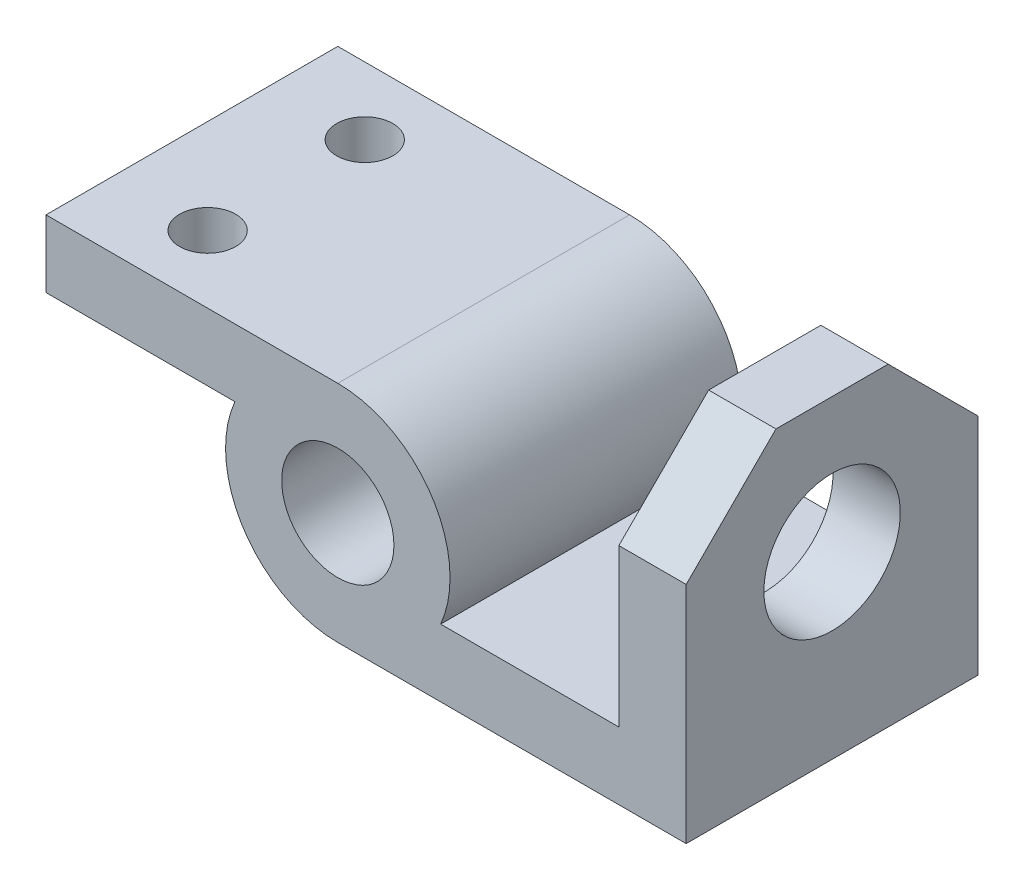
ISO-10303-21;
HEADER;
FILE_DESCRIPTION(('STEP AP214'),'2;1');
FILE_NAME('part.step','',(''),(''),'','','');
FILE_SCHEMA(('AUTOMOTIVE_DESIGN { 1 0 10303 214 1 1 1 1 }'));
ENDSEC;
DATA;
#1=APPLICATION_CONTEXT('core data for automotive mechanical design processes');
#2=APPLICATION_PROTOCOL_DEFINITION('international standard','automotive_design',2000,#1);
#3=PRODUCT_CONTEXT('',#1,'mechanical');
#4=PRODUCT('Part','Part','',(#3));
#5=PRODUCT_RELATED_PRODUCT_CATEGORY('part','',(#4));
#6=PRODUCT_DEFINITION_FORMATION('','',#4);
#7=PRODUCT_DEFINITION_CONTEXT('part definition',#1,'design');
#8=PRODUCT_DEFINITION('design','',#6,#7);
#9=PRODUCT_DEFINITION_SHAPE('','',#8);
#10=(LENGTH_UNIT() NAMED_UNIT(*) SI_UNIT(.MILLI.,.METRE.));
#11=(NAMED_UNIT(*) PLANE_ANGLE_UNIT() SI_UNIT($,.RADIAN.));
#12=(NAMED_UNIT(*) SI_UNIT($,.STERADIAN.) SOLID_ANGLE_UNIT());
#13=UNCERTAINTY_MEASURE_WITH_UNIT(LENGTH_MEASURE(1.E-05),#10,'distance_accuracy_value','');
#14=(GEOMETRIC_REPRESENTATION_CONTEXT(3) GLOBAL_UNCERTAINTY_ASSIGNED_CONTEXT((#13)) GLOBAL_UNIT_ASSIGNED_CONTEXT((#10,
#11,#12)) REPRESENTATION_CONTEXT('',''));
#15=CARTESIAN_POINT('',(0.,0.,0.));
#16=DIRECTION('',(0.,0.,1.));
#17=DIRECTION('',(1.,0.,0.));
#18=AXIS2_PLACEMENT_3D('',#15,#16,#17);
#19=CARTESIAN_POINT('',(0.,12.7,82.55));
#20=DIRECTION('',(0.,1.,0.));
#21=DIRECTION('',(-1.,0.,0.));
#22=AXIS2_PLACEMENT_3D('',#19,#20,#21);
#23=PLANE('',#22);
#24=CARTESIAN_POINT('',(-55.88,12.7,19.05));
#25=DIRECTION('',(0.,1.,0.));
#26=DIRECTION('',(-1.,0.,0.));
#27=AXIS2_PLACEMENT_3D('',#24,#25,#26);
#28=CIRCLE('',#27,7.9375);
#29=CARTESIAN_POINT('',(-63.8175,12.7,19.05));
#30=VERTEX_POINT('',#29);
#31=EDGE_CURVE('E282',#30,#30,#28,.T.);
#32=ORIENTED_EDGE('',*,*,#31,.T.);
#33=EDGE_LOOP('',(#32));
#34=FACE_BOUND('',#33,.T.);
#35=CARTESIAN_POINT('',(-55.88,12.7,63.5));
#36=DIRECTION('',(0.,1.,0.));
#37=DIRECTION('',(-1.,0.,0.));
#38=AXIS2_PLACEMENT_3D('',#35,#36,#37);
#39=CIRCLE('',#38,7.9375);
#40=CARTESIAN_POINT('',(-63.8175,12.7,63.5));
#41=VERTEX_POINT('',#40);
#42=EDGE_CURVE('E286',#41,#41,#39,.T.);
#43=ORIENTED_EDGE('',*,*,#42,.T.);
#44=EDGE_LOOP('',(#43));
#45=FACE_BOUND('',#44,.T.);
#46=DIRECTION('',(1.,0.,0.));
#47=VECTOR('',#46,1.);
#48=CARTESIAN_POINT('',(0.,12.7,0.));
#49=LINE('',#48,#47);
#50=CARTESIAN_POINT('',(-82.55,12.7,0.));
#51=VERTEX_POINT('',#50);
#52=CARTESIAN_POINT('',(-29.0993556629696,12.7,0.));
#53=VERTEX_POINT('',#52);
#54=EDGE_CURVE('E145',#51,#53,#49,.T.);
#55=ORIENTED_EDGE('',*,*,#54,.T.);
#56=DIRECTION('',(0.,0.,-1.));
#57=VECTOR('',#56,1.);
#58=CARTESIAN_POINT('',(-29.0993556629696,12.7,82.55));
#59=LINE('',#58,#57);
#60=CARTESIAN_POINT('',(-29.0993556629696,12.7,82.55));
#61=VERTEX_POINT('',#60);
#62=EDGE_CURVE('E11',#61,#53,#59,.T.);
#63=ORIENTED_EDGE('',*,*,#62,.F.);
#64=DIRECTION('',(1.,0.,0.));
#65=VECTOR('',#64,1.);
#66=CARTESIAN_POINT('',(0.,12.7,82.55));
#67=LINE('',#66,#65);
#68=CARTESIAN_POINT('',(-82.55,12.7,82.55));
#69=VERTEX_POINT('',#68);
#70=EDGE_CURVE('E168',#69,#61,#67,.T.);
#71=ORIENTED_EDGE('',*,*,#70,.F.);
#72=DIRECTION('',(0.,0.,-1.));
#73=VECTOR('',#72,1.);
#74=CARTESIAN_POINT('',(-82.55,12.7,82.55));
#75=LINE('',#74,#73);
#76=EDGE_CURVE('E144',#69,#51,#75,.T.);
#77=ORIENTED_EDGE('',*,*,#76,.T.);
#78=EDGE_LOOP('',(#55,#63,#71,#77));
#79=FACE_BOUND('',#78,.T.);
#80=ADVANCED_FACE('F42',(#34,#45,#79),#23,.F.);
#81=CARTESIAN_POINT('',(0.,0.,82.55));
#82=DIRECTION('',(0.,0.,-1.));
#83=DIRECTION('',(-1.,0.,0.));
#84=AXIS2_PLACEMENT_3D('',#81,#82,#83);
#85=CYLINDRICAL_SURFACE('',#84,31.75);
#86=CARTESIAN_POINT('',(0.,0.,0.));
#87=DIRECTION('',(0.,0.,1.));
#88=DIRECTION('',(1.,0.,0.));
#89=AXIS2_PLACEMENT_3D('',#86,#87,#88);
#90=CIRCLE('',#89,31.75);
#91=CARTESIAN_POINT('',(0.,-31.75,0.));
#92=VERTEX_POINT('',#91);
#93=EDGE_CURVE('E149',#53,#92,#90,.T.);
#94=ORIENTED_EDGE('',*,*,#93,.T.);
#95=DIRECTION('',(0.,0.,-1.));
#96=VECTOR('',#95,1.);
#97=CARTESIAN_POINT('',(0.,-31.75,82.55));
#98=LINE('',#97,#96);
#99=CARTESIAN_POINT('',(0.,-31.75,82.55));
#100=VERTEX_POINT('',#99);
#101=EDGE_CURVE('E51',#100,#92,#98,.T.);
#102=ORIENTED_EDGE('',*,*,#101,.F.);
#103=CARTESIAN_POINT('',(0.,0.,82.55));
#104=DIRECTION('',(0.,0.,1.));
#105=DIRECTION('',(1.,0.,0.));
#106=AXIS2_PLACEMENT_3D('',#103,#104,#105);
#107=CIRCLE('',#106,31.75);
#108=EDGE_CURVE('E100',#61,#100,#107,.T.);
#109=ORIENTED_EDGE('',*,*,#108,.F.);
#110=ORIENTED_EDGE('',*,*,#62,.T.);
#111=EDGE_LOOP('',(#94,#102,#109,#110));
#112=FACE_BOUND('',#111,.T.);
#113=ADVANCED_FACE('F330',(#112),#85,.T.);
#114=CARTESIAN_POINT('',(0.,-31.75,82.55));
#115=DIRECTION('',(0.,1.,0.));
#116=DIRECTION('',(0.,0.,1.));
#117=AXIS2_PLACEMENT_3D('',#114,#115,#116);
#118=PLANE('',#117);
#119=DIRECTION('',(1.,0.,0.));
#120=VECTOR('',#119,1.);
#121=CARTESIAN_POINT('',(0.,-31.75,0.));
#122=LINE('',#121,#120);
#123=CARTESIAN_POINT('',(98.552,-31.75,0.));
#124=VERTEX_POINT('',#123);
#125=EDGE_CURVE('E153',#92,#124,#122,.T.);
#126=ORIENTED_EDGE('',*,*,#125,.T.);
#127=DIRECTION('',(0.,0.,-1.));
#128=VECTOR('',#127,1.);
#129=CARTESIAN_POINT('',(98.552,-31.75,82.55));
#130=LINE('',#129,#128);
#131=CARTESIAN_POINT('',(98.552,-31.75,82.55));
#132=VERTEX_POINT('',#131);
#133=EDGE_CURVE('E208',#132,#124,#130,.T.);
#134=ORIENTED_EDGE('',*,*,#133,.F.);
#135=DIRECTION('',(1.,0.,0.));
#136=VECTOR('',#135,1.);
#137=CARTESIAN_POINT('',(0.,-31.75,82.55));
#138=LINE('',#137,#136);
#139=EDGE_CURVE('E189',#100,#132,#138,.T.);
#140=ORIENTED_EDGE('',*,*,#139,.F.);
#141=ORIENTED_EDGE('',*,*,#101,.T.);
#142=EDGE_LOOP('',(#126,#134,#140,#141));
#143=FACE_BOUND('',#142,.T.);
#144=ADVANCED_FACE('F184',(#143),#118,.F.);
#145=CARTESIAN_POINT('',(0.,-12.7,82.55));
#146=DIRECTION('',(0.,-1.,0.));
#147=DIRECTION('',(1.,0.,0.));
#148=AXIS2_PLACEMENT_3D('',#145,#146,#147);
#149=PLANE('',#148);
#150=DIRECTION('',(-1.,0.,0.));
#151=VECTOR('',#150,1.);
#152=CARTESIAN_POINT('',(0.,-12.7,0.));
#153=LINE('',#152,#151);
#154=CARTESIAN_POINT('',(79.502,-12.7,0.));
#155=VERTEX_POINT('',#154);
#156=CARTESIAN_POINT('',(29.0993556629696,-12.7,0.));
#157=VERTEX_POINT('',#156);
#158=EDGE_CURVE('E157',#155,#157,#153,.T.);
#159=ORIENTED_EDGE('',*,*,#158,.T.);
#160=DIRECTION('',(0.,0.,-1.));
#161=VECTOR('',#160,1.);
#162=CARTESIAN_POINT('',(29.0993556629696,-12.7,82.55));
#163=LINE('',#162,#161);
#164=CARTESIAN_POINT('',(29.0993556629696,-12.7,82.55));
#165=VERTEX_POINT('',#164);
#166=EDGE_CURVE('E128',#165,#157,#163,.T.);
#167=ORIENTED_EDGE('',*,*,#166,.F.);
#168=DIRECTION('',(-1.,0.,0.));
#169=VECTOR('',#168,1.);
#170=CARTESIAN_POINT('',(0.,-12.7,82.55));
#171=LINE('',#170,#169);
#172=CARTESIAN_POINT('',(79.502,-12.7,82.55));
#173=VERTEX_POINT('',#172);
#174=EDGE_CURVE('E117',#173,#165,#171,.T.);
#175=ORIENTED_EDGE('',*,*,#174,.F.);
#176=DIRECTION('',(0.,0.,-1.));
#177=VECTOR('',#176,1.);
#178=CARTESIAN_POINT('',(79.502,-12.7,82.55));
#179=LINE('',#178,#177);
#180=EDGE_CURVE('E175',#173,#155,#179,.T.);
#181=ORIENTED_EDGE('',*,*,#180,.T.);
#182=EDGE_LOOP('',(#159,#167,#175,#181));
#183=FACE_BOUND('',#182,.T.);
#184=ADVANCED_FACE('F338',(#183),#149,.F.);
#185=CARTESIAN_POINT('',(0.,31.75,0.));
#186=VERTEX_POINT('',#185);
#187=EDGE_CURVE('E126',#157,#186,#90,.T.);
#188=ORIENTED_EDGE('',*,*,#187,.T.);
#189=DIRECTION('',(0.,0.,-1.));
#190=VECTOR('',#189,1.);
#191=CARTESIAN_POINT('',(0.,31.75,82.55));
#192=LINE('',#191,#190);
#193=CARTESIAN_POINT('',(0.,31.75,82.55));
#194=VERTEX_POINT('',#193);
#195=EDGE_CURVE('E123',#194,#186,#192,.T.);
#196=ORIENTED_EDGE('',*,*,#195,.F.);
#197=EDGE_CURVE('E109',#165,#194,#107,.T.);
#198=ORIENTED_EDGE('',*,*,#197,.F.);
#199=ORIENTED_EDGE('',*,*,#166,.T.);
#200=EDGE_LOOP('',(#188,#196,#198,#199));
#201=FACE_BOUND('',#200,.T.);
#202=ADVANCED_FACE('F124',(#201),#85,.T.);
#203=CARTESIAN_POINT('',(0.,31.75,82.55));
#204=DIRECTION('',(0.,-1.,0.));
#205=DIRECTION('',(1.,0.,0.));
#206=AXIS2_PLACEMENT_3D('',#203,#204,#205);
#207=PLANE('',#206);
#208=CARTESIAN_POINT('',(-55.88,31.75,19.05));
#209=DIRECTION('',(0.,1.,0.));
#210=DIRECTION('',(-1.,0.,0.));
#211=AXIS2_PLACEMENT_3D('',#208,#209,#210);
#212=CIRCLE('',#211,7.9375);
#213=CARTESIAN_POINT('',(-63.8175,31.75,19.05));
#214=VERTEX_POINT('',#213);
#215=EDGE_CURVE('E294',#214,#214,#212,.T.);
#216=ORIENTED_EDGE('',*,*,#215,.F.);
#217=EDGE_LOOP('',(#216));
#218=FACE_BOUND('',#217,.T.);
#219=CARTESIAN_POINT('',(-55.88,31.75,63.5));
#220=DIRECTION('',(0.,1.,0.));
#221=DIRECTION('',(-1.,0.,0.));
#222=AXIS2_PLACEMENT_3D('',#219,#220,#221);
#223=CIRCLE('',#222,7.9375);
#224=CARTESIAN_POINT('',(-63.8175,31.75,63.5));
#225=VERTEX_POINT('',#224);
#226=EDGE_CURVE('E290',#225,#225,#223,.T.);
#227=ORIENTED_EDGE('',*,*,#226,.F.);
#228=EDGE_LOOP('',(#227));
#229=FACE_BOUND('',#228,.T.);
#230=DIRECTION('',(-1.,0.,0.));
#231=VECTOR('',#230,1.);
#232=CARTESIAN_POINT('',(0.,31.75,0.));
#233=LINE('',#232,#231);
#234=CARTESIAN_POINT('',(-82.55,31.75,0.));
#235=VERTEX_POINT('',#234);
#236=EDGE_CURVE('E86',#186,#235,#233,.T.);
#237=ORIENTED_EDGE('',*,*,#236,.T.);
#238=DIRECTION('',(0.,0.,-1.));
#239=VECTOR('',#238,1.);
#240=CARTESIAN_POINT('',(-82.55,31.75,82.55));
#241=LINE('',#240,#239);
#242=CARTESIAN_POINT('',(-82.55,31.75,82.55));
#243=VERTEX_POINT('',#242);
#244=EDGE_CURVE('E129',#243,#235,#241,.T.);
#245=ORIENTED_EDGE('',*,*,#244,.F.);
#246=DIRECTION('',(-1.,0.,0.));
#247=VECTOR('',#246,1.);
#248=CARTESIAN_POINT('',(0.,31.75,82.55));
#249=LINE('',#248,#247);
#250=EDGE_CURVE('E114',#194,#243,#249,.T.);
#251=ORIENTED_EDGE('',*,*,#250,.F.);
#252=ORIENTED_EDGE('',*,*,#195,.T.);
#253=EDGE_LOOP('',(#237,#245,#251,#252));
#254=FACE_BOUND('',#253,.T.);
#255=ADVANCED_FACE('F131',(#218,#229,#254),#207,.F.);
#256=CARTESIAN_POINT('',(-82.55,0.,82.55));
#257=DIRECTION('',(1.,0.,0.));
#258=DIRECTION('',(0.,0.,-1.));
#259=AXIS2_PLACEMENT_3D('',#256,#257,#258);
#260=PLANE('',#259);
#261=DIRECTION('',(0.,-1.,0.));
#262=VECTOR('',#261,1.);
#263=CARTESIAN_POINT('',(-82.55,0.,0.));
#264=LINE('',#263,#262);
#265=EDGE_CURVE('E92',#235,#51,#264,.T.);
#266=ORIENTED_EDGE('',*,*,#265,.T.);
#267=ORIENTED_EDGE('',*,*,#76,.F.);
#268=DIRECTION('',(0.,-1.,0.));
#269=VECTOR('',#268,1.);
#270=CARTESIAN_POINT('',(-82.55,0.,82.55));
#271=LINE('',#270,#269);
#272=EDGE_CURVE('E59',#243,#69,#271,.T.);
#273=ORIENTED_EDGE('',*,*,#272,.F.);
#274=ORIENTED_EDGE('',*,*,#244,.T.);
#275=EDGE_LOOP('',(#266,#267,#273,#274));
#276=FACE_BOUND('',#275,.T.);
#277=ADVANCED_FACE('F314',(#276),#260,.F.);
#278=CARTESIAN_POINT('',(0.,0.,82.55));
#279=DIRECTION('',(0.,0.,-1.));
#280=DIRECTION('',(-1.,0.,0.));
#281=AXIS2_PLACEMENT_3D('',#278,#279,#280);
#282=CYLINDRICAL_SURFACE('',#281,15.875);
#283=CARTESIAN_POINT('',(0.,0.,82.55));
#284=DIRECTION('',(0.,0.,1.));
#285=DIRECTION('',(1.,0.,0.));
#286=AXIS2_PLACEMENT_3D('',#283,#284,#285);
#287=CIRCLE('',#286,15.875);
#288=CARTESIAN_POINT('',(15.875,0.,82.55));
#289=VERTEX_POINT('',#288);
#290=EDGE_CURVE('E136',#289,#289,#287,.T.);
#291=ORIENTED_EDGE('',*,*,#290,.T.);
#292=EDGE_LOOP('',(#291));
#293=FACE_BOUND('',#292,.T.);
#294=CARTESIAN_POINT('',(0.,0.,0.));
#295=DIRECTION('',(0.,0.,1.));
#296=DIRECTION('',(1.,0.,0.));
#297=AXIS2_PLACEMENT_3D('',#294,#295,#296);
#298=CIRCLE('',#297,15.875);
#299=CARTESIAN_POINT('',(15.875,0.,0.));
#300=VERTEX_POINT('',#299);
#301=EDGE_CURVE('E164',#300,#300,#298,.T.);
#302=ORIENTED_EDGE('',*,*,#301,.F.);
#303=EDGE_LOOP('',(#302));
#304=FACE_BOUND('',#303,.T.);
#305=ADVANCED_FACE('F371',(#293,#304),#282,.F.);
#306=CARTESIAN_POINT('',(0.,0.,82.55));
#307=DIRECTION('',(0.,0.,1.));
#308=DIRECTION('',(1.,0.,0.));
#309=AXIS2_PLACEMENT_3D('',#306,#307,#308);
#310=PLANE('',#309);
#311=ORIENTED_EDGE('',*,*,#70,.T.);
#312=ORIENTED_EDGE('',*,*,#108,.T.);
#313=ORIENTED_EDGE('',*,*,#139,.T.);
#314=DIRECTION('',(0.,-1.,0.));
#315=VECTOR('',#314,1.);
#316=CARTESIAN_POINT('',(98.552,31.75,82.55));
#317=LINE('',#316,#315);
#318=CARTESIAN_POINT('',(98.552,31.75,82.55));
#319=VERTEX_POINT('',#318);
#320=EDGE_CURVE('E215',#319,#132,#317,.T.);
#321=ORIENTED_EDGE('',*,*,#320,.F.);
#322=DIRECTION('',(-1.,0.,0.));
#323=VECTOR('',#322,1.);
#324=CARTESIAN_POINT('',(98.552,31.75,82.55));
#325=LINE('',#324,#323);
#326=CARTESIAN_POINT('',(79.502,31.75,82.55));
#327=VERTEX_POINT('',#326);
#328=EDGE_CURVE('E226',#319,#327,#325,.T.);
#329=ORIENTED_EDGE('',*,*,#328,.T.);
#330=DIRECTION('',(0.,-1.,0.));
#331=VECTOR('',#330,1.);
#332=CARTESIAN_POINT('',(79.502,31.75,82.55));
#333=LINE('',#332,#331);
#334=EDGE_CURVE('E227',#327,#173,#333,.T.);
#335=ORIENTED_EDGE('',*,*,#334,.T.);
#336=ORIENTED_EDGE('',*,*,#174,.T.);
#337=ORIENTED_EDGE('',*,*,#197,.T.);
#338=ORIENTED_EDGE('',*,*,#250,.T.);
#339=ORIENTED_EDGE('',*,*,#272,.T.);
#340=EDGE_LOOP('',(#311,#312,#313,#321,#329,#335,#336,#337,#338,#339));
#341=FACE_BOUND('',#340,.T.);
#342=ORIENTED_EDGE('',*,*,#290,.F.);
#343=EDGE_LOOP('',(#342));
#344=FACE_BOUND('',#343,.T.);
#345=ADVANCED_FACE('F111',(#341,#344),#310,.T.);
#346=CARTESIAN_POINT('',(0.,0.,0.));
#347=DIRECTION('',(0.,0.,1.));
#348=DIRECTION('',(1.,0.,0.));
#349=AXIS2_PLACEMENT_3D('',#346,#347,#348);
#350=PLANE('',#349);
#351=ORIENTED_EDGE('',*,*,#54,.F.);
#352=ORIENTED_EDGE('',*,*,#265,.F.);
#353=ORIENTED_EDGE('',*,*,#236,.F.);
#354=ORIENTED_EDGE('',*,*,#187,.F.);
#355=ORIENTED_EDGE('',*,*,#158,.F.);
#356=DIRECTION('',(0.,1.,0.));
#357=VECTOR('',#356,1.);
#358=CARTESIAN_POINT('',(79.502,-31.75,0.));
#359=LINE('',#358,#357);
#360=CARTESIAN_POINT('',(79.502,31.75,0.));
#361=VERTEX_POINT('',#360);
#362=EDGE_CURVE('E230',#155,#361,#359,.T.);
#363=ORIENTED_EDGE('',*,*,#362,.T.);
#364=DIRECTION('',(-1.,0.,0.));
#365=VECTOR('',#364,1.);
#366=CARTESIAN_POINT('',(98.552,31.75,0.));
#367=LINE('',#366,#365);
#368=CARTESIAN_POINT('',(98.552,31.75,0.));
#369=VERTEX_POINT('',#368);
#370=EDGE_CURVE('E150',#369,#361,#367,.T.);
#371=ORIENTED_EDGE('',*,*,#370,.F.);
#372=DIRECTION('',(0.,1.,0.));
#373=VECTOR('',#372,1.);
#374=CARTESIAN_POINT('',(98.552,-31.75,0.));
#375=LINE('',#374,#373);
#376=EDGE_CURVE('E197',#124,#369,#375,.T.);
#377=ORIENTED_EDGE('',*,*,#376,.F.);
#378=ORIENTED_EDGE('',*,*,#125,.F.);
#379=ORIENTED_EDGE('',*,*,#93,.F.);
#380=EDGE_LOOP('',(#351,#352,#353,#354,#355,#363,#371,#377,#378,#379));
#381=FACE_BOUND('',#380,.T.);
#382=ORIENTED_EDGE('',*,*,#301,.T.);
#383=EDGE_LOOP('',(#382));
#384=FACE_BOUND('',#383,.T.);
#385=ADVANCED_FACE('F193',(#381,#384),#350,.F.);
#386=CARTESIAN_POINT('',(98.552,0.,0.));
#387=DIRECTION('',(1.,0.,0.));
#388=DIRECTION('',(0.,0.,-1.));
#389=AXIS2_PLACEMENT_3D('',#386,#387,#388);
#390=PLANE('',#389);
#391=ORIENTED_EDGE('',*,*,#320,.T.);
#392=ORIENTED_EDGE('',*,*,#133,.T.);
#393=ORIENTED_EDGE('',*,*,#376,.T.);
#394=DIRECTION('',(0.,0.707106781186547,0.707106781186548));
#395=VECTOR('',#394,1.);
#396=CARTESIAN_POINT('',(98.552,31.75,0.));
#397=LINE('',#396,#395);
#398=CARTESIAN_POINT('',(98.552,57.15,25.4));
#399=VERTEX_POINT('',#398);
#400=EDGE_CURVE('E207',#369,#399,#397,.T.);
#401=ORIENTED_EDGE('',*,*,#400,.T.);
#402=DIRECTION('',(0.,0.,1.));
#403=VECTOR('',#402,1.);
#404=CARTESIAN_POINT('',(98.552,57.15,25.4));
#405=LINE('',#404,#403);
#406=CARTESIAN_POINT('',(98.552,57.15,57.15));
#407=VERTEX_POINT('',#406);
#408=EDGE_CURVE('E213',#399,#407,#405,.T.);
#409=ORIENTED_EDGE('',*,*,#408,.T.);
#410=DIRECTION('',(0.,-0.707106781186547,0.707106781186548));
#411=VECTOR('',#410,1.);
#412=CARTESIAN_POINT('',(98.552,57.15,57.15));
#413=LINE('',#412,#411);
#414=EDGE_CURVE('E222',#407,#319,#413,.T.);
#415=ORIENTED_EDGE('',*,*,#414,.T.);
#416=EDGE_LOOP('',(#391,#392,#393,#401,#409,#415));
#417=FACE_BOUND('',#416,.T.);
#418=CARTESIAN_POINT('',(98.552,19.05,41.275));
#419=DIRECTION('',(1.,0.,0.));
#420=DIRECTION('',(0.,0.,-1.));
#421=AXIS2_PLACEMENT_3D('',#418,#419,#420);
#422=CIRCLE('',#421,19.304);
#423=CARTESIAN_POINT('',(98.552,19.05,60.579));
#424=VERTEX_POINT('',#423);
#425=EDGE_CURVE('E231',#424,#424,#422,.T.);
#426=ORIENTED_EDGE('',*,*,#425,.F.);
#427=EDGE_LOOP('',(#426));
#428=FACE_BOUND('',#427,.T.);
#429=ADVANCED_FACE('F271',(#417,#428),#390,.T.);
#430=CARTESIAN_POINT('',(79.502,0.,0.));
#431=DIRECTION('',(1.,0.,0.));
#432=DIRECTION('',(0.,0.,-1.));
#433=AXIS2_PLACEMENT_3D('',#430,#431,#432);
#434=PLANE('',#433);
#435=ORIENTED_EDGE('',*,*,#180,.F.);
#436=ORIENTED_EDGE('',*,*,#334,.F.);
#437=DIRECTION('',(0.,-0.707106781186547,0.707106781186548));
#438=VECTOR('',#437,1.);
#439=CARTESIAN_POINT('',(79.502,57.15,57.15));
#440=LINE('',#439,#438);
#441=CARTESIAN_POINT('',(79.502,57.15,57.15));
#442=VERTEX_POINT('',#441);
#443=EDGE_CURVE('E242',#442,#327,#440,.T.);
#444=ORIENTED_EDGE('',*,*,#443,.F.);
#445=DIRECTION('',(0.,0.,1.));
#446=VECTOR('',#445,1.);
#447=CARTESIAN_POINT('',(79.502,57.15,25.4));
#448=LINE('',#447,#446);
#449=CARTESIAN_POINT('',(79.502,57.15,25.4));
#450=VERTEX_POINT('',#449);
#451=EDGE_CURVE('E238',#450,#442,#448,.T.);
#452=ORIENTED_EDGE('',*,*,#451,.F.);
#453=DIRECTION('',(0.,0.707106781186547,0.707106781186548));
#454=VECTOR('',#453,1.);
#455=CARTESIAN_POINT('',(79.502,31.75,0.));
#456=LINE('',#455,#454);
#457=EDGE_CURVE('E234',#361,#450,#456,.T.);
#458=ORIENTED_EDGE('',*,*,#457,.F.);
#459=ORIENTED_EDGE('',*,*,#362,.F.);
#460=EDGE_LOOP('',(#435,#436,#444,#452,#458,#459));
#461=FACE_BOUND('',#460,.T.);
#462=CARTESIAN_POINT('',(79.502,19.05,41.275));
#463=DIRECTION('',(1.,0.,0.));
#464=DIRECTION('',(0.,0.,-1.));
#465=AXIS2_PLACEMENT_3D('',#462,#463,#464);
#466=CIRCLE('',#465,19.304);
#467=CARTESIAN_POINT('',(79.502,19.05,60.579));
#468=VERTEX_POINT('',#467);
#469=EDGE_CURVE('E278',#468,#468,#466,.T.);
#470=ORIENTED_EDGE('',*,*,#469,.T.);
#471=EDGE_LOOP('',(#470));
#472=FACE_BOUND('',#471,.T.);
#473=ADVANCED_FACE('F387',(#461,#472),#434,.F.);
#474=CARTESIAN_POINT('',(98.552,31.75,0.));
#475=DIRECTION('',(0.,-0.707106781186548,0.707106781186547));
#476=DIRECTION('',(0.,-0.707106781186547,-0.707106781186548));
#477=AXIS2_PLACEMENT_3D('',#474,#475,#476);
#478=PLANE('',#477);
#479=ORIENTED_EDGE('',*,*,#457,.T.);
#480=DIRECTION('',(-1.,0.,0.));
#481=VECTOR('',#480,1.);
#482=CARTESIAN_POINT('',(98.552,57.15,25.4));
#483=LINE('',#482,#481);
#484=EDGE_CURVE('E253',#399,#450,#483,.T.);
#485=ORIENTED_EDGE('',*,*,#484,.F.);
#486=ORIENTED_EDGE('',*,*,#400,.F.);
#487=ORIENTED_EDGE('',*,*,#370,.T.);
#488=EDGE_LOOP('',(#479,#485,#486,#487));
#489=FACE_BOUND('',#488,.T.);
#490=ADVANCED_FACE('F383',(#489),#478,.F.);
#491=CARTESIAN_POINT('',(98.552,57.15,25.4));
#492=DIRECTION('',(0.,-1.,0.));
#493=DIRECTION('',(0.,0.,-1.));
#494=AXIS2_PLACEMENT_3D('',#491,#492,#493);
#495=PLANE('',#494);
#496=ORIENTED_EDGE('',*,*,#451,.T.);
#497=DIRECTION('',(-1.,0.,0.));
#498=VECTOR('',#497,1.);
#499=CARTESIAN_POINT('',(98.552,57.15,57.15));
#500=LINE('',#499,#498);
#501=EDGE_CURVE('E249',#407,#442,#500,.T.);
#502=ORIENTED_EDGE('',*,*,#501,.F.);
#503=ORIENTED_EDGE('',*,*,#408,.F.);
#504=ORIENTED_EDGE('',*,*,#484,.T.);
#505=EDGE_LOOP('',(#496,#502,#503,#504));
#506=FACE_BOUND('',#505,.T.);
#507=ADVANCED_FACE('F386',(#506),#495,.F.);
#508=CARTESIAN_POINT('',(98.552,57.15,57.15));
#509=DIRECTION('',(0.,-0.707106781186548,-0.707106781186547));
#510=DIRECTION('',(0.,0.707106781186547,-0.707106781186548));
#511=AXIS2_PLACEMENT_3D('',#508,#509,#510);
#512=PLANE('',#511);
#513=ORIENTED_EDGE('',*,*,#443,.T.);
#514=ORIENTED_EDGE('',*,*,#328,.F.);
#515=ORIENTED_EDGE('',*,*,#414,.F.);
#516=ORIENTED_EDGE('',*,*,#501,.T.);
#517=EDGE_LOOP('',(#513,#514,#515,#516));
#518=FACE_BOUND('',#517,.T.);
#519=ADVANCED_FACE('F325',(#518),#512,.F.);
#520=CARTESIAN_POINT('',(98.552,19.05,41.275));
#521=DIRECTION('',(-1.,0.,0.));
#522=DIRECTION('',(0.,0.,1.));
#523=AXIS2_PLACEMENT_3D('',#520,#521,#522);
#524=CYLINDRICAL_SURFACE('',#523,19.304);
#525=CARTESIAN_POINT('',(98.552,19.05,60.579));
#526=CARTESIAN_POINT('',(98.3535625,19.05,60.579));
#527=CARTESIAN_POINT('',(98.155125,19.05,60.579));
#528=CARTESIAN_POINT('',(97.75825,19.05,60.579));
#529=CARTESIAN_POINT('',(97.5598125,19.05,60.579));
#530=CARTESIAN_POINT('',(97.1629375,19.05,60.579));
#531=CARTESIAN_POINT('',(96.9645,19.05,60.579));
#532=CARTESIAN_POINT('',(96.567625,19.05,60.579));
#533=CARTESIAN_POINT('',(96.3691875,19.05,60.579));
#534=CARTESIAN_POINT('',(95.9723125,19.05,60.579));
#535=CARTESIAN_POINT('',(95.773875,19.05,60.579));
#536=CARTESIAN_POINT('',(95.377,19.05,60.579));
#537=CARTESIAN_POINT('',(95.1785625,19.05,60.579));
#538=CARTESIAN_POINT('',(94.7816875,19.05,60.579));
#539=CARTESIAN_POINT('',(94.58325,19.05,60.579));
#540=CARTESIAN_POINT('',(94.186375,19.05,60.579));
#541=CARTESIAN_POINT('',(93.9879375,19.05,60.579));
#542=CARTESIAN_POINT('',(93.5910625,19.05,60.579));
#543=CARTESIAN_POINT('',(93.392625,19.05,60.579));
#544=CARTESIAN_POINT('',(92.99575,19.05,60.579));
#545=CARTESIAN_POINT('',(92.7973125,19.05,60.579));
#546=CARTESIAN_POINT('',(92.4004375,19.05,60.579));
#547=CARTESIAN_POINT('',(92.202,19.05,60.579));
#548=CARTESIAN_POINT('',(91.805125,19.05,60.579));
#549=CARTESIAN_POINT('',(91.6066875,19.05,60.579));
#550=CARTESIAN_POINT('',(91.2098125,19.05,60.579));
#551=CARTESIAN_POINT('',(91.011375,19.05,60.579));
#552=CARTESIAN_POINT('',(90.6145,19.05,60.579));
#553=CARTESIAN_POINT('',(90.4160625,19.05,60.579));
#554=CARTESIAN_POINT('',(90.0191875,19.05,60.579));
#555=CARTESIAN_POINT('',(89.82075,19.05,60.579));
#556=CARTESIAN_POINT('',(89.423875,19.05,60.579));
#557=CARTESIAN_POINT('',(89.2254375,19.05,60.579));
#558=CARTESIAN_POINT('',(88.8285625,19.05,60.579));
#559=CARTESIAN_POINT('',(88.630125,19.05,60.579));
#560=CARTESIAN_POINT('',(88.23325,19.05,60.579));
#561=CARTESIAN_POINT('',(88.0348125,19.05,60.579));
#562=CARTESIAN_POINT('',(87.6379375,19.05,60.579));
#563=CARTESIAN_POINT('',(87.4395,19.05,60.579));
#564=CARTESIAN_POINT('',(87.042625,19.05,60.579));
#565=CARTESIAN_POINT('',(86.8441875,19.05,60.579));
#566=CARTESIAN_POINT('',(86.4473125,19.05,60.579));
#567=CARTESIAN_POINT('',(86.248875,19.05,60.579));
#568=CARTESIAN_POINT('',(85.852,19.05,60.579));
#569=CARTESIAN_POINT('',(85.6535625,19.05,60.579));
#570=CARTESIAN_POINT('',(85.2566875,19.05,60.579));
#571=CARTESIAN_POINT('',(85.05825,19.05,60.579));
#572=CARTESIAN_POINT('',(84.661375,19.05,60.579));
#573=CARTESIAN_POINT('',(84.4629375,19.05,60.579));
#574=CARTESIAN_POINT('',(84.0660625,19.05,60.579));
#575=CARTESIAN_POINT('',(83.867625,19.05,60.579));
#576=CARTESIAN_POINT('',(83.47075,19.05,60.579));
#577=CARTESIAN_POINT('',(83.2723125,19.05,60.579));
#578=CARTESIAN_POINT('',(82.8754375,19.05,60.579));
#579=CARTESIAN_POINT('',(82.677,19.05,60.579));
#580=CARTESIAN_POINT('',(82.280125,19.05,60.579));
#581=CARTESIAN_POINT('',(82.0816875,19.05,60.579));
#582=CARTESIAN_POINT('',(81.6848125,19.05,60.579));
#583=CARTESIAN_POINT('',(81.486375,19.05,60.579));
#584=CARTESIAN_POINT('',(81.0895,19.05,60.579));
#585=CARTESIAN_POINT('',(80.8910625,19.05,60.579));
#586=CARTESIAN_POINT('',(80.4941875,19.05,60.579));
#587=CARTESIAN_POINT('',(80.29575,19.05,60.579));
#588=CARTESIAN_POINT('',(79.898875,19.05,60.579));
#589=CARTESIAN_POINT('',(79.7004375,19.05,60.579));
#590=CARTESIAN_POINT('',(79.502,19.05,60.579));
#591=B_SPLINE_CURVE_WITH_KNOTS('',3,(#525,#526,#527,#528,#529,#530,#531,#532,#533,#534,#535,
#536,#537,#538,#539,#540,#541,#542,#543,#544,#545,#546,#547,#548,#549,#550,#551,#552,#553,#554,
#555,#556,#557,#558,#559,#560,#561,#562,#563,#564,#565,#566,#567,#568,#569,#570,#571,#572,#573,
#574,#575,#576,#577,#578,#579,#580,#581,#582,#583,#584,#585,#586,#587,#588,#589,#590),
.UNSPECIFIED.,.F.,.F.,(4,2,2,2,2,2,2,2,2,2,2,2,2,2,2,2,2,2,2,2,2,2,2,2,2,2,2,2,2,2,2,2,4),(0.,
0.5953125,1.190625,1.7859375,2.38125,2.9765625,3.571875,4.1671875,4.7625,5.3578125,5.953125,
6.5484375,7.14375,7.7390625,8.334375,8.92968750000001,9.52500000000001,10.1203125,10.715625,
11.3109375,11.90625,12.5015625,13.096875,13.6921875,14.2875,14.8828125,15.478125,16.0734375,
16.66875,17.2640625,17.859375,18.4546875,19.05),.UNSPECIFIED.);
#592=EDGE_CURVE('BSEAM319',#424,#468,#591,.T.);
#593=ORIENTED_EDGE('',*,*,#425,.T.);
#594=ORIENTED_EDGE('',*,*,#469,.F.);
#595=ORIENTED_EDGE('',*,*,#592,.T.);
#596=ORIENTED_EDGE('',*,*,#592,.F.);
#597=EDGE_LOOP('',(#593,#595,#594,#596));
#598=FACE_BOUND('',#597,.T.);
#599=ADVANCED_FACE('F319',(#598),#524,.F.);
#600=CARTESIAN_POINT('',(-55.88,12.7,63.5));
#601=DIRECTION('',(0.,1.,0.));
#602=DIRECTION('',(-1.,0.,0.));
#603=AXIS2_PLACEMENT_3D('',#600,#601,#602);
#604=CYLINDRICAL_SURFACE('',#603,7.9375);
#605=CARTESIAN_POINT('',(-63.8175,12.7,63.5));
#606=CARTESIAN_POINT('',(-63.8175,12.8984375,63.5));
#607=CARTESIAN_POINT('',(-63.8175,13.096875,63.5));
#608=CARTESIAN_POINT('',(-63.8175,13.49375,63.5));
#609=CARTESIAN_POINT('',(-63.8175,13.6921875,63.5));
#610=CARTESIAN_POINT('',(-63.8175,14.0890625,63.5));
#611=CARTESIAN_POINT('',(-63.8175,14.2875,63.5));
#612=CARTESIAN_POINT('',(-63.8175,14.684375,63.5));
#613=CARTESIAN_POINT('',(-63.8175,14.8828125,63.5));
#614=CARTESIAN_POINT('',(-63.8175,15.2796875,63.5));
#615=CARTESIAN_POINT('',(-63.8175,15.478125,63.5));
#616=CARTESIAN_POINT('',(-63.8175,15.875,63.5));
#617=CARTESIAN_POINT('',(-63.8175,16.0734375,63.5));
#618=CARTESIAN_POINT('',(-63.8175,16.4703125,63.5));
#619=CARTESIAN_POINT('',(-63.8175,16.66875,63.5));
#620=CARTESIAN_POINT('',(-63.8175,17.065625,63.5));
#621=CARTESIAN_POINT('',(-63.8175,17.2640625,63.5));
#622=CARTESIAN_POINT('',(-63.8175,17.6609375,63.5));
#623=CARTESIAN_POINT('',(-63.8175,17.859375,63.5));
#624=CARTESIAN_POINT('',(-63.8175,18.25625,63.5));
#625=CARTESIAN_POINT('',(-63.8175,18.4546875,63.5));
#626=CARTESIAN_POINT('',(-63.8175,18.8515625,63.5));
#627=CARTESIAN_POINT('',(-63.8175,19.05,63.5));
#628=CARTESIAN_POINT('',(-63.8175,19.446875,63.5));
#629=CARTESIAN_POINT('',(-63.8175,19.6453125,63.5));
#630=CARTESIAN_POINT('',(-63.8175,20.0421875,63.5));
#631=CARTESIAN_POINT('',(-63.8175,20.240625,63.5));
#632=CARTESIAN_POINT('',(-63.8175,20.6375,63.5));
#633=CARTESIAN_POINT('',(-63.8175,20.8359375,63.5));
#634=CARTESIAN_POINT('',(-63.8175,21.2328125,63.5));
#635=CARTESIAN_POINT('',(-63.8175,21.43125,63.5));
#636=CARTESIAN_POINT('',(-63.8175,21.828125,63.5));
#637=CARTESIAN_POINT('',(-63.8175,22.0265625,63.5));
#638=CARTESIAN_POINT('',(-63.8175,22.4234375,63.5));
#639=CARTESIAN_POINT('',(-63.8175,22.621875,63.5));
#640=CARTESIAN_POINT('',(-63.8175,23.01875,63.5));
#641=CARTESIAN_POINT('',(-63.8175,23.2171875,63.5));
#642=CARTESIAN_POINT('',(-63.8175,23.6140625,63.5));
#643=CARTESIAN_POINT('',(-63.8175,23.8125,63.5));
#644=CARTESIAN_POINT('',(-63.8175,24.209375,63.5));
#645=CARTESIAN_POINT('',(-63.8175,24.4078125,63.5));
#646=CARTESIAN_POINT('',(-63.8175,24.8046875,63.5));
#647=CARTESIAN_POINT('',(-63.8175,25.003125,63.5));
#648=CARTESIAN_POINT('',(-63.8175,25.4,63.5));
#649=CARTESIAN_POINT('',(-63.8175,25.5984375,63.5));
#650=CARTESIAN_POINT('',(-63.8175,25.9953125,63.5));
#651=CARTESIAN_POINT('',(-63.8175,26.19375,63.5));
#652=CARTESIAN_POINT('',(-63.8175,26.590625,63.5));
#653=CARTESIAN_POINT('',(-63.8175,26.7890625,63.5));
#654=CARTESIAN_POINT('',(-63.8175,27.1859375,63.5));
#655=CARTESIAN_POINT('',(-63.8175,27.384375,63.5));
#656=CARTESIAN_POINT('',(-63.8175,27.78125,63.5));
#657=CARTESIAN_POINT('',(-63.8175,27.9796875,63.5));
#658=CARTESIAN_POINT('',(-63.8175,28.3765625,63.5));
#659=CARTESIAN_POINT('',(-63.8175,28.575,63.5));
#660=CARTESIAN_POINT('',(-63.8175,28.971875,63.5));
#661=CARTESIAN_POINT('',(-63.8175,29.1703125,63.5));
#662=CARTESIAN_POINT('',(-63.8175,29.5671875,63.5));
#663=CARTESIAN_POINT('',(-63.8175,29.765625,63.5));
#664=CARTESIAN_POINT('',(-63.8175,30.1625,63.5));
#665=CARTESIAN_POINT('',(-63.8175,30.3609375,63.5));
#666=CARTESIAN_POINT('',(-63.8175,30.7578125,63.5));
#667=CARTESIAN_POINT('',(-63.8175,30.95625,63.5));
#668=CARTESIAN_POINT('',(-63.8175,31.353125,63.5));
#669=CARTESIAN_POINT('',(-63.8175,31.5515625,63.5));
#670=CARTESIAN_POINT('',(-63.8175,31.75,63.5));
#671=B_SPLINE_CURVE_WITH_KNOTS('',3,(#605,#606,#607,#608,#609,#610,#611,#612,#613,#614,#615,
#616,#617,#618,#619,#620,#621,#622,#623,#624,#625,#626,#627,#628,#629,#630,#631,#632,#633,#634,
#635,#636,#637,#638,#639,#640,#641,#642,#643,#644,#645,#646,#647,#648,#649,#650,#651,#652,#653,
#654,#655,#656,#657,#658,#659,#660,#661,#662,#663,#664,#665,#666,#667,#668,#669,#670),
.UNSPECIFIED.,.F.,.F.,(4,2,2,2,2,2,2,2,2,2,2,2,2,2,2,2,2,2,2,2,2,2,2,2,2,2,2,2,2,2,2,2,4),(0.,
0.5953125,1.190625,1.7859375,2.38125,2.9765625,3.571875,4.1671875,4.7625,5.3578125,5.953125,
6.5484375,7.14375,7.7390625,8.334375,8.9296875,9.525,10.1203125,10.715625,11.3109375,11.90625,
12.5015625,13.096875,13.6921875,14.2875,14.8828125,15.478125,16.0734375,16.66875,17.2640625,
17.859375,18.4546875,19.05),.UNSPECIFIED.);
#672=EDGE_CURVE('BSEAM308',#41,#225,#671,.T.);
#673=ORIENTED_EDGE('',*,*,#42,.F.);
#674=ORIENTED_EDGE('',*,*,#226,.T.);
#675=ORIENTED_EDGE('',*,*,#672,.T.);
#676=ORIENTED_EDGE('',*,*,#672,.F.);
#677=EDGE_LOOP('',(#673,#675,#674,#676));
#678=FACE_BOUND('',#677,.T.);
#679=ADVANCED_FACE('F308',(#678),#604,.F.);
#680=CARTESIAN_POINT('',(-55.88,12.7,19.05));
#681=DIRECTION('',(0.,1.,0.));
#682=DIRECTION('',(-1.,0.,0.));
#683=AXIS2_PLACEMENT_3D('',#680,#681,#682);
#684=CYLINDRICAL_SURFACE('',#683,7.9375);
#685=CARTESIAN_POINT('',(-63.8175,12.7,19.05));
#686=CARTESIAN_POINT('',(-63.8175,12.8984375,19.05));
#687=CARTESIAN_POINT('',(-63.8175,13.096875,19.05));
#688=CARTESIAN_POINT('',(-63.8175,13.49375,19.05));
#689=CARTESIAN_POINT('',(-63.8175,13.6921875,19.05));
#690=CARTESIAN_POINT('',(-63.8175,14.0890625,19.05));
#691=CARTESIAN_POINT('',(-63.8175,14.2875,19.05));
#692=CARTESIAN_POINT('',(-63.8175,14.684375,19.05));
#693=CARTESIAN_POINT('',(-63.8175,14.8828125,19.05));
#694=CARTESIAN_POINT('',(-63.8175,15.2796875,19.05));
#695=CARTESIAN_POINT('',(-63.8175,15.478125,19.05));
#696=CARTESIAN_POINT('',(-63.8175,15.875,19.05));
#697=CARTESIAN_POINT('',(-63.8175,16.0734375,19.05));
#698=CARTESIAN_POINT('',(-63.8175,16.4703125,19.05));
#699=CARTESIAN_POINT('',(-63.8175,16.66875,19.05));
#700=CARTESIAN_POINT('',(-63.8175,17.065625,19.05));
#701=CARTESIAN_POINT('',(-63.8175,17.2640625,19.05));
#702=CARTESIAN_POINT('',(-63.8175,17.6609375,19.05));
#703=CARTESIAN_POINT('',(-63.8175,17.859375,19.05));
#704=CARTESIAN_POINT('',(-63.8175,18.25625,19.05));
#705=CARTESIAN_POINT('',(-63.8175,18.4546875,19.05));
#706=CARTESIAN_POINT('',(-63.8175,18.8515625,19.05));
#707=CARTESIAN_POINT('',(-63.8175,19.05,19.05));
#708=CARTESIAN_POINT('',(-63.8175,19.446875,19.05));
#709=CARTESIAN_POINT('',(-63.8175,19.6453125,19.05));
#710=CARTESIAN_POINT('',(-63.8175,20.0421875,19.05));
#711=CARTESIAN_POINT('',(-63.8175,20.240625,19.05));
#712=CARTESIAN_POINT('',(-63.8175,20.6375,19.05));
#713=CARTESIAN_POINT('',(-63.8175,20.8359375,19.05));
#714=CARTESIAN_POINT('',(-63.8175,21.2328125,19.05));
#715=CARTESIAN_POINT('',(-63.8175,21.43125,19.05));
#716=CARTESIAN_POINT('',(-63.8175,21.828125,19.05));
#717=CARTESIAN_POINT('',(-63.8175,22.0265625,19.05));
#718=CARTESIAN_POINT('',(-63.8175,22.4234375,19.05));
#719=CARTESIAN_POINT('',(-63.8175,22.621875,19.05));
#720=CARTESIAN_POINT('',(-63.8175,23.01875,19.05));
#721=CARTESIAN_POINT('',(-63.8175,23.2171875,19.05));
#722=CARTESIAN_POINT('',(-63.8175,23.6140625,19.05));
#723=CARTESIAN_POINT('',(-63.8175,23.8125,19.05));
#724=CARTESIAN_POINT('',(-63.8175,24.209375,19.05));
#725=CARTESIAN_POINT('',(-63.8175,24.4078125,19.05));
#726=CARTESIAN_POINT('',(-63.8175,24.8046875,19.05));
#727=CARTESIAN_POINT('',(-63.8175,25.003125,19.05));
#728=CARTESIAN_POINT('',(-63.8175,25.4,19.05));
#729=CARTESIAN_POINT('',(-63.8175,25.5984375,19.05));
#730=CARTESIAN_POINT('',(-63.8175,25.9953125,19.05));
#731=CARTESIAN_POINT('',(-63.8175,26.19375,19.05));
#732=CARTESIAN_POINT('',(-63.8175,26.590625,19.05));
#733=CARTESIAN_POINT('',(-63.8175,26.7890625,19.05));
#734=CARTESIAN_POINT('',(-63.8175,27.1859375,19.05));
#735=CARTESIAN_POINT('',(-63.8175,27.384375,19.05));
#736=CARTESIAN_POINT('',(-63.8175,27.78125,19.05));
#737=CARTESIAN_POINT('',(-63.8175,27.9796875,19.05));
#738=CARTESIAN_POINT('',(-63.8175,28.3765625,19.05));
#739=CARTESIAN_POINT('',(-63.8175,28.575,19.05));
#740=CARTESIAN_POINT('',(-63.8175,28.971875,19.05));
#741=CARTESIAN_POINT('',(-63.8175,29.1703125,19.05));
#742=CARTESIAN_POINT('',(-63.8175,29.5671875,19.05));
#743=CARTESIAN_POINT('',(-63.8175,29.765625,19.05));
#744=CARTESIAN_POINT('',(-63.8175,30.1625,19.05));
#745=CARTESIAN_POINT('',(-63.8175,30.3609375,19.05));
#746=CARTESIAN_POINT('',(-63.8175,30.7578125,19.05));
#747=CARTESIAN_POINT('',(-63.8175,30.95625,19.05));
#748=CARTESIAN_POINT('',(-63.8175,31.353125,19.05));
#749=CARTESIAN_POINT('',(-63.8175,31.5515625,19.05));
#750=CARTESIAN_POINT('',(-63.8175,31.75,19.05));
#751=B_SPLINE_CURVE_WITH_KNOTS('',3,(#685,#686,#687,#688,#689,#690,#691,#692,#693,#694,#695,
#696,#697,#698,#699,#700,#701,#702,#703,#704,#705,#706,#707,#708,#709,#710,#711,#712,#713,#714,
#715,#716,#717,#718,#719,#720,#721,#722,#723,#724,#725,#726,#727,#728,#729,#730,#731,#732,#733,
#734,#735,#736,#737,#738,#739,#740,#741,#742,#743,#744,#745,#746,#747,#748,#749,#750),
.UNSPECIFIED.,.F.,.F.,(4,2,2,2,2,2,2,2,2,2,2,2,2,2,2,2,2,2,2,2,2,2,2,2,2,2,2,2,2,2,2,2,4),(0.,
0.5953125,1.190625,1.7859375,2.38125,2.9765625,3.571875,4.1671875,4.7625,5.3578125,5.953125,
6.5484375,7.14375,7.7390625,8.334375,8.9296875,9.525,10.1203125,10.715625,11.3109375,11.90625,
12.5015625,13.096875,13.6921875,14.2875,14.8828125,15.478125,16.0734375,16.66875,17.2640625,
17.859375,18.4546875,19.05),.UNSPECIFIED.);
#752=EDGE_CURVE('BSEAM305',#30,#214,#751,.T.);
#753=ORIENTED_EDGE('',*,*,#31,.F.);
#754=ORIENTED_EDGE('',*,*,#215,.T.);
#755=ORIENTED_EDGE('',*,*,#752,.T.);
#756=ORIENTED_EDGE('',*,*,#752,.F.);
#757=EDGE_LOOP('',(#753,#755,#754,#756));
#758=FACE_BOUND('',#757,.T.);
#759=ADVANCED_FACE('F305',(#758),#684,.F.);
#760=CLOSED_SHELL('',(#80,#113,#144,#184,#202,#255,#277,#305,#345,#385,#429,#473,#490,#507,#519,
#599,#679,#759));
#761=MANIFOLD_SOLID_BREP('B2',#760);
#762=ADVANCED_BREP_SHAPE_REPRESENTATION('',(#18,#761),#14);
#763=SHAPE_DEFINITION_REPRESENTATION(#9,#762);
ENDSEC;
END-ISO-10303-21;
